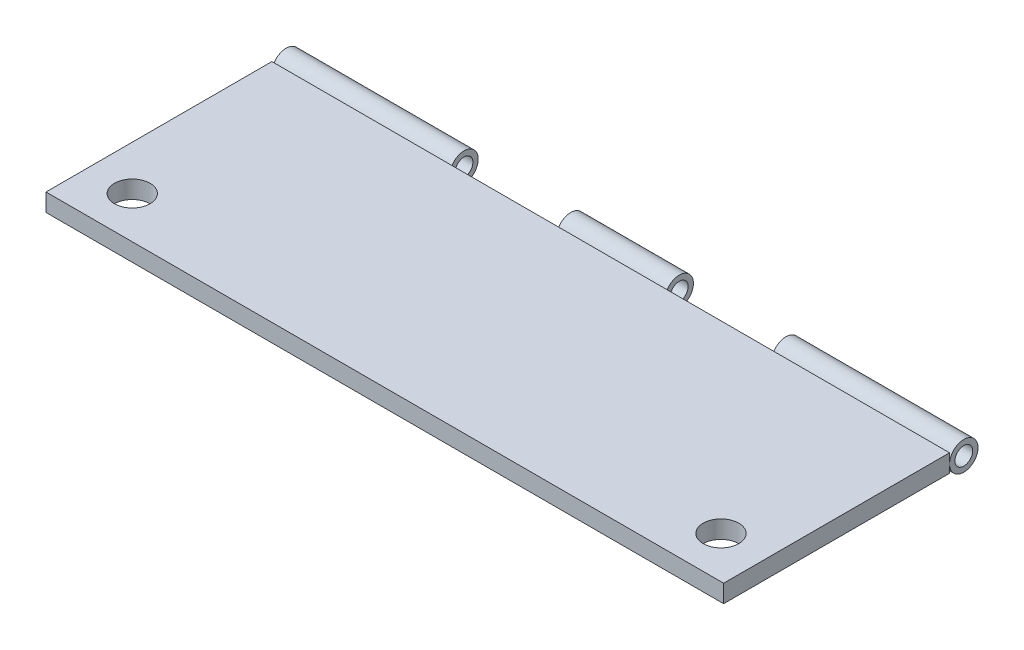
ISO-10303-21;
HEADER;
FILE_DESCRIPTION(('STEP AP214'),'2;1');
FILE_NAME('part.step','',(''),(''),'','','');
FILE_SCHEMA(('AUTOMOTIVE_DESIGN { 1 0 10303 214 1 1 1 1 }'));
ENDSEC;
DATA;
#1=APPLICATION_CONTEXT('core data for automotive mechanical design processes');
#2=APPLICATION_PROTOCOL_DEFINITION('international standard','automotive_design',2000,#1);
#3=PRODUCT_CONTEXT('',#1,'mechanical');
#4=PRODUCT('Part','Part','',(#3));
#5=PRODUCT_RELATED_PRODUCT_CATEGORY('part','',(#4));
#6=PRODUCT_DEFINITION_FORMATION('','',#4);
#7=PRODUCT_DEFINITION_CONTEXT('part definition',#1,'design');
#8=PRODUCT_DEFINITION('design','',#6,#7);
#9=PRODUCT_DEFINITION_SHAPE('','',#8);
#10=(LENGTH_UNIT() NAMED_UNIT(*) SI_UNIT(.MILLI.,.METRE.));
#11=(NAMED_UNIT(*) PLANE_ANGLE_UNIT() SI_UNIT($,.RADIAN.));
#12=(NAMED_UNIT(*) SI_UNIT($,.STERADIAN.) SOLID_ANGLE_UNIT());
#13=UNCERTAINTY_MEASURE_WITH_UNIT(LENGTH_MEASURE(1.E-05),#10,'distance_accuracy_value','');
#14=(GEOMETRIC_REPRESENTATION_CONTEXT(3) GLOBAL_UNCERTAINTY_ASSIGNED_CONTEXT((#13)) GLOBAL_UNIT_ASSIGNED_CONTEXT((#10,
#11,#12)) REPRESENTATION_CONTEXT('',''));
#15=CARTESIAN_POINT('',(0.,0.,0.));
#16=DIRECTION('',(0.,0.,1.));
#17=DIRECTION('',(1.,0.,0.));
#18=AXIS2_PLACEMENT_3D('',#15,#16,#17);
#19=CARTESIAN_POINT('',(42.6254833995939,0.901009784155106,-14.3061802949504));
#20=DIRECTION('',(-1.,0.,0.));
#21=DIRECTION('',(0.,0.,1.));
#22=AXIS2_PLACEMENT_3D('',#19,#20,#21);
#23=CYLINDRICAL_SURFACE('',#22,1.6);
#24=CARTESIAN_POINT('',(-6.09999999999996,0.901009784155106,-14.3061802949504));
#25=DIRECTION('',(1.,0.,0.));
#26=DIRECTION('',(0.,0.,-1.));
#27=AXIS2_PLACEMENT_3D('',#24,#25,#26);
#28=CIRCLE('',#27,1.6);
#29=CARTESIAN_POINT('',(-6.09999999999996,0.901009784155106,-15.9061802949504));
#30=VERTEX_POINT('',#29);
#31=EDGE_CURVE('E47',#30,#30,#28,.F.);
#32=ORIENTED_EDGE('',*,*,#31,.F.);
#33=EDGE_LOOP('',(#32));
#34=FACE_BOUND('',#33,.T.);
#35=CARTESIAN_POINT('',(6.10000000000004,0.901009784155106,-14.3061802949504));
#36=DIRECTION('',(1.,0.,0.));
#37=DIRECTION('',(0.,0.,-1.));
#38=AXIS2_PLACEMENT_3D('',#35,#36,#37);
#39=CIRCLE('',#38,1.6);
#40=CARTESIAN_POINT('',(6.10000000000004,0.901009784155106,-15.9061802949504));
#41=VERTEX_POINT('',#40);
#42=EDGE_CURVE('E43',#41,#41,#39,.F.);
#43=ORIENTED_EDGE('',*,*,#42,.T.);
#44=EDGE_LOOP('',(#43));
#45=FACE_BOUND('',#44,.T.);
#46=ADVANCED_FACE('F39',(#34,#45),#23,.T.);
#47=CARTESIAN_POINT('',(40.9284271247462,0.901009784155106,-14.3061802949504));
#48=DIRECTION('',(-1.,0.,0.));
#49=DIRECTION('',(0.,0.,1.));
#50=AXIS2_PLACEMENT_3D('',#47,#48,#49);
#51=CYLINDRICAL_SURFACE('',#50,1.);
#52=CARTESIAN_POINT('',(-6.09999999999996,0.901009784155106,-14.3061802949504));
#53=DIRECTION('',(1.,0.,0.));
#54=DIRECTION('',(0.,0.,-1.));
#55=AXIS2_PLACEMENT_3D('',#52,#53,#54);
#56=CIRCLE('',#55,1.);
#57=CARTESIAN_POINT('',(-6.09999999999996,0.901009784155106,-13.3061802949504));
#58=VERTEX_POINT('',#57);
#59=EDGE_CURVE('E52',#58,#58,#56,.F.);
#60=CARTESIAN_POINT('',(6.10000000000004,0.901009784155106,-14.3061802949504));
#61=DIRECTION('',(1.,0.,0.));
#62=DIRECTION('',(0.,0.,-1.));
#63=AXIS2_PLACEMENT_3D('',#60,#61,#62);
#64=CIRCLE('',#63,1.);
#65=CARTESIAN_POINT('',(6.10000000000003,0.901009784155106,-13.3061802949504));
#66=VERTEX_POINT('',#65);
#67=EDGE_CURVE('E11',#66,#66,#64,.F.);
#68=CARTESIAN_POINT('',(-6.09999999999996,0.901009784155106,-13.3061802949504));
#69=CARTESIAN_POINT('',(-5.97291666666663,0.901009784155106,-13.3061802949504));
#70=CARTESIAN_POINT('',(-5.84583333333329,0.901009784155106,-13.3061802949504));
#71=CARTESIAN_POINT('',(-5.59166666666663,0.901009784155106,-13.3061802949504));
#72=CARTESIAN_POINT('',(-5.46458333333329,0.901009784155106,-13.3061802949504));
#73=CARTESIAN_POINT('',(-5.21041666666663,0.901009784155106,-13.3061802949504));
#74=CARTESIAN_POINT('',(-5.08333333333329,0.901009784155106,-13.3061802949504));
#75=CARTESIAN_POINT('',(-4.82916666666663,0.901009784155106,-13.3061802949504));
#76=CARTESIAN_POINT('',(-4.70208333333329,0.901009784155106,-13.3061802949504));
#77=CARTESIAN_POINT('',(-4.44791666666663,0.901009784155106,-13.3061802949504));
#78=CARTESIAN_POINT('',(-4.32083333333329,0.901009784155106,-13.3061802949504));
#79=CARTESIAN_POINT('',(-4.06666666666663,0.901009784155106,-13.3061802949504));
#80=CARTESIAN_POINT('',(-3.9395833333333,0.901009784155106,-13.3061802949504));
#81=CARTESIAN_POINT('',(-3.68541666666663,0.901009784155106,-13.3061802949504));
#82=CARTESIAN_POINT('',(-3.5583333333333,0.901009784155106,-13.3061802949504));
#83=CARTESIAN_POINT('',(-3.30416666666663,0.901009784155106,-13.3061802949504));
#84=CARTESIAN_POINT('',(-3.1770833333333,0.901009784155106,-13.3061802949504));
#85=CARTESIAN_POINT('',(-2.92291666666663,0.901009784155106,-13.3061802949504));
#86=CARTESIAN_POINT('',(-2.7958333333333,0.901009784155106,-13.3061802949504));
#87=CARTESIAN_POINT('',(-2.54166666666663,0.901009784155106,-13.3061802949504));
#88=CARTESIAN_POINT('',(-2.4145833333333,0.901009784155106,-13.3061802949504));
#89=CARTESIAN_POINT('',(-2.16041666666663,0.901009784155106,-13.3061802949504));
#90=CARTESIAN_POINT('',(-2.0333333333333,0.901009784155106,-13.3061802949504));
#91=CARTESIAN_POINT('',(-1.77916666666663,0.901009784155106,-13.3061802949504));
#92=CARTESIAN_POINT('',(-1.6520833333333,0.901009784155106,-13.3061802949504));
#93=CARTESIAN_POINT('',(-1.39791666666663,0.901009784155106,-13.3061802949504));
#94=CARTESIAN_POINT('',(-1.2708333333333,0.901009784155106,-13.3061802949504));
#95=CARTESIAN_POINT('',(-1.01666666666663,0.901009784155106,-13.3061802949504));
#96=CARTESIAN_POINT('',(-0.889583333333298,0.901009784155106,-13.3061802949504));
#97=CARTESIAN_POINT('',(-0.635416666666631,0.901009784155106,-13.3061802949504));
#98=CARTESIAN_POINT('',(-0.508333333333298,0.901009784155106,-13.3061802949504));
#99=CARTESIAN_POINT('',(-0.254166666666632,0.901009784155106,-13.3061802949504));
#100=CARTESIAN_POINT('',(-0.127083333333299,0.901009784155106,-13.3061802949504));
#101=CARTESIAN_POINT('',(0.127083333333368,0.901009784155106,-13.3061802949504));
#102=CARTESIAN_POINT('',(0.254166666666701,0.901009784155106,-13.3061802949504));
#103=CARTESIAN_POINT('',(0.508333333333367,0.901009784155106,-13.3061802949504));
#104=CARTESIAN_POINT('',(0.635416666666701,0.901009784155106,-13.3061802949504));
#105=CARTESIAN_POINT('',(0.889583333333367,0.901009784155106,-13.3061802949504));
#106=CARTESIAN_POINT('',(1.0166666666667,0.901009784155106,-13.3061802949504));
#107=CARTESIAN_POINT('',(1.27083333333337,0.901009784155106,-13.3061802949504));
#108=CARTESIAN_POINT('',(1.3979166666667,0.901009784155106,-13.3061802949504));
#109=CARTESIAN_POINT('',(1.65208333333337,0.901009784155106,-13.3061802949504));
#110=CARTESIAN_POINT('',(1.7791666666667,0.901009784155106,-13.3061802949504));
#111=CARTESIAN_POINT('',(2.03333333333337,0.901009784155106,-13.3061802949504));
#112=CARTESIAN_POINT('',(2.1604166666667,0.901009784155106,-13.3061802949504));
#113=CARTESIAN_POINT('',(2.41458333333337,0.901009784155106,-13.3061802949504));
#114=CARTESIAN_POINT('',(2.5416666666667,0.901009784155106,-13.3061802949504));
#115=CARTESIAN_POINT('',(2.79583333333337,0.901009784155106,-13.3061802949504));
#116=CARTESIAN_POINT('',(2.9229166666667,0.901009784155106,-13.3061802949504));
#117=CARTESIAN_POINT('',(3.17708333333337,0.901009784155106,-13.3061802949504));
#118=CARTESIAN_POINT('',(3.3041666666667,0.901009784155106,-13.3061802949504));
#119=CARTESIAN_POINT('',(3.55833333333336,0.901009784155106,-13.3061802949504));
#120=CARTESIAN_POINT('',(3.6854166666667,0.901009784155106,-13.3061802949504));
#121=CARTESIAN_POINT('',(3.93958333333336,0.901009784155106,-13.3061802949504));
#122=CARTESIAN_POINT('',(4.0666666666667,0.901009784155106,-13.3061802949504));
#123=CARTESIAN_POINT('',(4.32083333333336,0.901009784155106,-13.3061802949504));
#124=CARTESIAN_POINT('',(4.4479166666667,0.901009784155106,-13.3061802949504));
#125=CARTESIAN_POINT('',(4.70208333333336,0.901009784155106,-13.3061802949504));
#126=CARTESIAN_POINT('',(4.8291666666667,0.901009784155106,-13.3061802949504));
#127=CARTESIAN_POINT('',(5.08333333333336,0.901009784155106,-13.3061802949504));
#128=CARTESIAN_POINT('',(5.2104166666667,0.901009784155106,-13.3061802949504));
#129=CARTESIAN_POINT('',(5.46458333333336,0.901009784155106,-13.3061802949504));
#130=CARTESIAN_POINT('',(5.5916666666667,0.901009784155106,-13.3061802949504));
#131=CARTESIAN_POINT('',(5.84583333333336,0.901009784155106,-13.3061802949504));
#132=CARTESIAN_POINT('',(5.9729166666667,0.901009784155106,-13.3061802949504));
#133=CARTESIAN_POINT('',(6.10000000000003,0.901009784155106,-13.3061802949504));
#134=B_SPLINE_CURVE_WITH_KNOTS('',3,(#68,#69,#70,#71,#72,#73,#74,#75,#76,#77,#78,#79,#80,#81,
#82,#83,#84,#85,#86,#87,#88,#89,#90,#91,#92,#93,#94,#95,#96,#97,#98,#99,#100,#101,#102,#103,
#104,#105,#106,#107,#108,#109,#110,#111,#112,#113,#114,#115,#116,#117,#118,#119,#120,#121,#122,
#123,#124,#125,#126,#127,#128,#129,#130,#131,#132,#133),.UNSPECIFIED.,.F.,.F.,(4,2,2,2,2,2,2,2,
2,2,2,2,2,2,2,2,2,2,2,2,2,2,2,2,2,2,2,2,2,2,2,2,4),(0.,0.38125,0.762499999999999,1.14375,1.525,
1.90625,2.2875,2.66875,3.05,3.43125,3.8125,4.19375,4.575,4.95625,5.3375,5.71874999999999,
6.09999999999999,6.48124999999999,6.86249999999999,7.24374999999999,7.62499999999999,
8.00624999999999,8.38749999999999,8.76874999999999,9.14999999999999,9.53124999999999,
9.91249999999999,10.29375,10.675,11.05625,11.4375,11.81875,12.2),.UNSPECIFIED.);
#135=EDGE_CURVE('BSEAM41',#58,#66,#134,.T.);
#136=ORIENTED_EDGE('',*,*,#59,.T.);
#137=ORIENTED_EDGE('',*,*,#67,.F.);
#138=ORIENTED_EDGE('',*,*,#135,.T.);
#139=ORIENTED_EDGE('',*,*,#135,.F.);
#140=EDGE_LOOP('',(#136,#138,#137,#139));
#141=FACE_BOUND('',#140,.T.);
#142=ADVANCED_FACE('F41',(#141),#51,.F.);
#143=CARTESIAN_POINT('',(-6.09999999999996,-0.699990215844896,-12.7061802949504));
#144=DIRECTION('',(1.,0.,0.));
#145=DIRECTION('',(0.,0.,-1.));
#146=AXIS2_PLACEMENT_3D('',#143,#144,#145);
#147=PLANE('',#146);
#148=ORIENTED_EDGE('',*,*,#31,.T.);
#149=EDGE_LOOP('',(#148));
#150=FACE_BOUND('',#149,.T.);
#151=ORIENTED_EDGE('',*,*,#59,.F.);
#152=EDGE_LOOP('',(#151));
#153=FACE_BOUND('',#152,.T.);
#154=ADVANCED_FACE('F63',(#150,#153),#147,.F.);
#155=CARTESIAN_POINT('',(6.10000000000003,-0.699990215844896,0.));
#156=DIRECTION('',(1.,0.,0.));
#157=DIRECTION('',(0.,0.,-1.));
#158=AXIS2_PLACEMENT_3D('',#155,#156,#157);
#159=PLANE('',#158);
#160=ORIENTED_EDGE('',*,*,#42,.F.);
#161=EDGE_LOOP('',(#160));
#162=FACE_BOUND('',#161,.T.);
#163=ORIENTED_EDGE('',*,*,#67,.T.);
#164=EDGE_LOOP('',(#163));
#165=FACE_BOUND('',#164,.T.);
#166=ADVANCED_FACE('F61',(#162,#165),#159,.T.);
#167=CLOSED_SHELL('',(#46,#142,#154,#166));
#168=MANIFOLD_SOLID_BREP('B2',#167);
#169=CARTESIAN_POINT('',(42.6254833995939,0.901009784155106,-14.3061802949504));
#170=DIRECTION('',(-1.,0.,0.));
#171=DIRECTION('',(0.,0.,1.));
#172=AXIS2_PLACEMENT_3D('',#169,#170,#171);
#173=CYLINDRICAL_SURFACE('',#172,1.6);
#174=CARTESIAN_POINT('',(-38.1,0.901009784155106,-14.3061802949504));
#175=DIRECTION('',(-1.,0.,0.));
#176=DIRECTION('',(0.,0.,1.));
#177=AXIS2_PLACEMENT_3D('',#174,#175,#176);
#178=CIRCLE('',#177,1.6);
#179=CARTESIAN_POINT('',(-38.1,0.901009784155106,-12.7061802949504));
#180=VERTEX_POINT('',#179);
#181=EDGE_CURVE('E128',#180,#180,#178,.T.);
#182=ORIENTED_EDGE('',*,*,#181,.F.);
#183=EDGE_LOOP('',(#182));
#184=FACE_BOUND('',#183,.T.);
#185=CARTESIAN_POINT('',(-18.1,0.901009784155106,-14.3061802949504));
#186=DIRECTION('',(1.,0.,0.));
#187=DIRECTION('',(0.,0.,-1.));
#188=AXIS2_PLACEMENT_3D('',#185,#186,#187);
#189=CIRCLE('',#188,1.6);
#190=CARTESIAN_POINT('',(-18.1,0.901009784155106,-15.9061802949504));
#191=VERTEX_POINT('',#190);
#192=EDGE_CURVE('E124',#191,#191,#189,.F.);
#193=ORIENTED_EDGE('',*,*,#192,.T.);
#194=EDGE_LOOP('',(#193));
#195=FACE_BOUND('',#194,.T.);
#196=ADVANCED_FACE('F120',(#184,#195),#173,.T.);
#197=CARTESIAN_POINT('',(40.9284271247462,0.901009784155106,-14.3061802949504));
#198=DIRECTION('',(-1.,0.,0.));
#199=DIRECTION('',(0.,0.,1.));
#200=AXIS2_PLACEMENT_3D('',#197,#198,#199);
#201=CYLINDRICAL_SURFACE('',#200,1.);
#202=CARTESIAN_POINT('',(-38.1,0.901009784155106,-14.3061802949504));
#203=DIRECTION('',(-1.,0.,0.));
#204=DIRECTION('',(0.,0.,1.));
#205=AXIS2_PLACEMENT_3D('',#202,#203,#204);
#206=CIRCLE('',#205,1.);
#207=CARTESIAN_POINT('',(-38.1,0.901009784155106,-13.3061802949504));
#208=VERTEX_POINT('',#207);
#209=EDGE_CURVE('E133',#208,#208,#206,.T.);
#210=CARTESIAN_POINT('',(-18.1,0.901009784155106,-14.3061802949504));
#211=DIRECTION('',(1.,0.,0.));
#212=DIRECTION('',(0.,0.,-1.));
#213=AXIS2_PLACEMENT_3D('',#210,#211,#212);
#214=CIRCLE('',#213,1.);
#215=CARTESIAN_POINT('',(-18.1,0.901009784155106,-13.3061802949504));
#216=VERTEX_POINT('',#215);
#217=EDGE_CURVE('E38',#216,#216,#214,.F.);
#218=CARTESIAN_POINT('',(-38.1,0.901009784155106,-13.3061802949504));
#219=CARTESIAN_POINT('',(-37.8916666666666,0.901009784155106,-13.3061802949504));
#220=CARTESIAN_POINT('',(-37.6833333333333,0.901009784155106,-13.3061802949504));
#221=CARTESIAN_POINT('',(-37.2666666666666,0.901009784155106,-13.3061802949504));
#222=CARTESIAN_POINT('',(-37.0583333333333,0.901009784155106,-13.3061802949504));
#223=CARTESIAN_POINT('',(-36.6416666666666,0.901009784155106,-13.3061802949504));
#224=CARTESIAN_POINT('',(-36.4333333333333,0.901009784155106,-13.3061802949504));
#225=CARTESIAN_POINT('',(-36.0166666666666,0.901009784155106,-13.3061802949504));
#226=CARTESIAN_POINT('',(-35.8083333333333,0.901009784155106,-13.3061802949504));
#227=CARTESIAN_POINT('',(-35.3916666666666,0.901009784155106,-13.3061802949504));
#228=CARTESIAN_POINT('',(-35.1833333333333,0.901009784155106,-13.3061802949504));
#229=CARTESIAN_POINT('',(-34.7666666666666,0.901009784155106,-13.3061802949504));
#230=CARTESIAN_POINT('',(-34.5583333333333,0.901009784155106,-13.3061802949504));
#231=CARTESIAN_POINT('',(-34.1416666666666,0.901009784155106,-13.3061802949504));
#232=CARTESIAN_POINT('',(-33.9333333333333,0.901009784155106,-13.3061802949504));
#233=CARTESIAN_POINT('',(-33.5166666666666,0.901009784155106,-13.3061802949504));
#234=CARTESIAN_POINT('',(-33.3083333333333,0.901009784155106,-13.3061802949504));
#235=CARTESIAN_POINT('',(-32.8916666666666,0.901009784155106,-13.3061802949504));
#236=CARTESIAN_POINT('',(-32.6833333333333,0.901009784155106,-13.3061802949504));
#237=CARTESIAN_POINT('',(-32.2666666666666,0.901009784155106,-13.3061802949504));
#238=CARTESIAN_POINT('',(-32.0583333333333,0.901009784155106,-13.3061802949504));
#239=CARTESIAN_POINT('',(-31.6416666666666,0.901009784155106,-13.3061802949504));
#240=CARTESIAN_POINT('',(-31.4333333333333,0.901009784155106,-13.3061802949504));
#241=CARTESIAN_POINT('',(-31.0166666666666,0.901009784155106,-13.3061802949504));
#242=CARTESIAN_POINT('',(-30.8083333333333,0.901009784155106,-13.3061802949504));
#243=CARTESIAN_POINT('',(-30.3916666666666,0.901009784155106,-13.3061802949504));
#244=CARTESIAN_POINT('',(-30.1833333333333,0.901009784155106,-13.3061802949504));
#245=CARTESIAN_POINT('',(-29.7666666666666,0.901009784155106,-13.3061802949504));
#246=CARTESIAN_POINT('',(-29.5583333333333,0.901009784155106,-13.3061802949504));
#247=CARTESIAN_POINT('',(-29.1416666666666,0.901009784155106,-13.3061802949504));
#248=CARTESIAN_POINT('',(-28.9333333333333,0.901009784155106,-13.3061802949504));
#249=CARTESIAN_POINT('',(-28.5166666666666,0.901009784155106,-13.3061802949504));
#250=CARTESIAN_POINT('',(-28.3083333333333,0.901009784155106,-13.3061802949504));
#251=CARTESIAN_POINT('',(-27.8916666666666,0.901009784155106,-13.3061802949504));
#252=CARTESIAN_POINT('',(-27.6833333333333,0.901009784155106,-13.3061802949504));
#253=CARTESIAN_POINT('',(-27.2666666666666,0.901009784155106,-13.3061802949504));
#254=CARTESIAN_POINT('',(-27.0583333333333,0.901009784155106,-13.3061802949504));
#255=CARTESIAN_POINT('',(-26.6416666666666,0.901009784155106,-13.3061802949504));
#256=CARTESIAN_POINT('',(-26.4333333333333,0.901009784155106,-13.3061802949504));
#257=CARTESIAN_POINT('',(-26.0166666666666,0.901009784155106,-13.3061802949504));
#258=CARTESIAN_POINT('',(-25.8083333333333,0.901009784155106,-13.3061802949504));
#259=CARTESIAN_POINT('',(-25.3916666666666,0.901009784155106,-13.3061802949504));
#260=CARTESIAN_POINT('',(-25.1833333333333,0.901009784155106,-13.3061802949504));
#261=CARTESIAN_POINT('',(-24.7666666666666,0.901009784155106,-13.3061802949504));
#262=CARTESIAN_POINT('',(-24.5583333333333,0.901009784155106,-13.3061802949504));
#263=CARTESIAN_POINT('',(-24.1416666666666,0.901009784155106,-13.3061802949504));
#264=CARTESIAN_POINT('',(-23.9333333333333,0.901009784155106,-13.3061802949504));
#265=CARTESIAN_POINT('',(-23.5166666666666,0.901009784155106,-13.3061802949504));
#266=CARTESIAN_POINT('',(-23.3083333333333,0.901009784155106,-13.3061802949504));
#267=CARTESIAN_POINT('',(-22.8916666666666,0.901009784155106,-13.3061802949504));
#268=CARTESIAN_POINT('',(-22.6833333333333,0.901009784155106,-13.3061802949504));
#269=CARTESIAN_POINT('',(-22.2666666666666,0.901009784155106,-13.3061802949504));
#270=CARTESIAN_POINT('',(-22.0583333333333,0.901009784155106,-13.3061802949504));
#271=CARTESIAN_POINT('',(-21.6416666666666,0.901009784155106,-13.3061802949504));
#272=CARTESIAN_POINT('',(-21.4333333333333,0.901009784155106,-13.3061802949504));
#273=CARTESIAN_POINT('',(-21.0166666666667,0.901009784155106,-13.3061802949504));
#274=CARTESIAN_POINT('',(-20.8083333333333,0.901009784155106,-13.3061802949504));
#275=CARTESIAN_POINT('',(-20.3916666666667,0.901009784155106,-13.3061802949504));
#276=CARTESIAN_POINT('',(-20.1833333333333,0.901009784155106,-13.3061802949504));
#277=CARTESIAN_POINT('',(-19.7666666666667,0.901009784155106,-13.3061802949504));
#278=CARTESIAN_POINT('',(-19.5583333333333,0.901009784155106,-13.3061802949504));
#279=CARTESIAN_POINT('',(-19.1416666666667,0.901009784155106,-13.3061802949504));
#280=CARTESIAN_POINT('',(-18.9333333333333,0.901009784155106,-13.3061802949504));
#281=CARTESIAN_POINT('',(-18.5166666666667,0.901009784155106,-13.3061802949504));
#282=CARTESIAN_POINT('',(-18.3083333333333,0.901009784155106,-13.3061802949504));
#283=CARTESIAN_POINT('',(-18.1,0.901009784155106,-13.3061802949504));
#284=B_SPLINE_CURVE_WITH_KNOTS('',3,(#218,#219,#220,#221,#222,#223,#224,#225,#226,#227,#228,
#229,#230,#231,#232,#233,#234,#235,#236,#237,#238,#239,#240,#241,#242,#243,#244,#245,#246,#247,
#248,#249,#250,#251,#252,#253,#254,#255,#256,#257,#258,#259,#260,#261,#262,#263,#264,#265,#266,
#267,#268,#269,#270,#271,#272,#273,#274,#275,#276,#277,#278,#279,#280,#281,#282,#283),
.UNSPECIFIED.,.F.,.F.,(4,2,2,2,2,2,2,2,2,2,2,2,2,2,2,2,2,2,2,2,2,2,2,2,2,2,2,2,2,2,2,2,4),(0.,
0.625000000000001,1.25,1.875,2.5,3.125,3.75,4.375,5.,5.62499999999999,6.24999999999999,
6.87499999999999,7.49999999999999,8.12499999999999,8.74999999999999,9.37499999999999,
9.99999999999999,10.625,11.25,11.875,12.5,13.125,13.75,14.375,15.,15.625,16.25,16.875,17.5,
18.125,18.75,19.375,20.),.UNSPECIFIED.);
#285=EDGE_CURVE('BSEAM122',#208,#216,#284,.T.);
#286=ORIENTED_EDGE('',*,*,#209,.T.);
#287=ORIENTED_EDGE('',*,*,#217,.F.);
#288=ORIENTED_EDGE('',*,*,#285,.T.);
#289=ORIENTED_EDGE('',*,*,#285,.F.);
#290=EDGE_LOOP('',(#286,#288,#287,#289));
#291=FACE_BOUND('',#290,.T.);
#292=ADVANCED_FACE('F122',(#291),#201,.F.);
#293=CARTESIAN_POINT('',(-38.1,0.901009784155106,-14.3061802949504));
#294=DIRECTION('',(-1.,0.,0.));
#295=DIRECTION('',(0.,0.,1.));
#296=AXIS2_PLACEMENT_3D('',#293,#294,#295);
#297=PLANE('',#296);
#298=ORIENTED_EDGE('',*,*,#209,.F.);
#299=EDGE_LOOP('',(#298));
#300=FACE_BOUND('',#299,.T.);
#301=ORIENTED_EDGE('',*,*,#181,.T.);
#302=EDGE_LOOP('',(#301));
#303=FACE_BOUND('',#302,.T.);
#304=ADVANCED_FACE('F144',(#300,#303),#297,.T.);
#305=CARTESIAN_POINT('',(-18.1,-0.699990215844896,-12.7061802949504));
#306=DIRECTION('',(1.,0.,0.));
#307=DIRECTION('',(0.,0.,-1.));
#308=AXIS2_PLACEMENT_3D('',#305,#306,#307);
#309=PLANE('',#308);
#310=ORIENTED_EDGE('',*,*,#192,.F.);
#311=EDGE_LOOP('',(#310));
#312=FACE_BOUND('',#311,.T.);
#313=ORIENTED_EDGE('',*,*,#217,.T.);
#314=EDGE_LOOP('',(#313));
#315=FACE_BOUND('',#314,.T.);
#316=ADVANCED_FACE('F142',(#312,#315),#309,.T.);
#317=CLOSED_SHELL('',(#196,#292,#304,#316));
#318=MANIFOLD_SOLID_BREP('B6',#317);
#319=CARTESIAN_POINT('',(42.6254833995939,0.901009784155106,-14.3061802949504));
#320=DIRECTION('',(-1.,0.,0.));
#321=DIRECTION('',(0.,0.,1.));
#322=AXIS2_PLACEMENT_3D('',#319,#320,#321);
#323=CYLINDRICAL_SURFACE('',#322,1.6);
#324=CARTESIAN_POINT('',(18.1,0.901009784155106,-14.3061802949504));
#325=DIRECTION('',(1.,0.,0.));
#326=DIRECTION('',(0.,0.,-1.));
#327=AXIS2_PLACEMENT_3D('',#324,#325,#326);
#328=CIRCLE('',#327,1.6);
#329=CARTESIAN_POINT('',(18.1,0.901009784155106,-15.9061802949504));
#330=VERTEX_POINT('',#329);
#331=EDGE_CURVE('E207',#330,#330,#328,.F.);
#332=ORIENTED_EDGE('',*,*,#331,.F.);
#333=EDGE_LOOP('',(#332));
#334=FACE_BOUND('',#333,.T.);
#335=CARTESIAN_POINT('',(38.1,0.901009784155106,-14.3061802949504));
#336=DIRECTION('',(-1.,0.,0.));
#337=DIRECTION('',(0.,0.,1.));
#338=AXIS2_PLACEMENT_3D('',#335,#336,#337);
#339=CIRCLE('',#338,1.6);
#340=CARTESIAN_POINT('',(38.1,0.901009784155106,-12.7061802949504));
#341=VERTEX_POINT('',#340);
#342=EDGE_CURVE('E119',#341,#341,#339,.F.);
#343=ORIENTED_EDGE('',*,*,#342,.F.);
#344=EDGE_LOOP('',(#343));
#345=FACE_BOUND('',#344,.T.);
#346=ADVANCED_FACE('F196',(#334,#345),#323,.T.);
#347=CARTESIAN_POINT('',(38.1,2.,12.7));
#348=DIRECTION('',(-1.,0.,0.));
#349=DIRECTION('',(0.,0.,1.));
#350=AXIS2_PLACEMENT_3D('',#347,#348,#349);
#351=PLANE('',#350);
#352=CARTESIAN_POINT('',(38.1,0.901009784155106,-14.3061802949504));
#353=DIRECTION('',(-1.,0.,0.));
#354=DIRECTION('',(0.,0.,1.));
#355=AXIS2_PLACEMENT_3D('',#352,#353,#354);
#356=CIRCLE('',#355,1.);
#357=CARTESIAN_POINT('',(38.1,0.901009784155106,-13.3061802949504));
#358=VERTEX_POINT('',#357);
#359=EDGE_CURVE('E203',#358,#358,#356,.F.);
#360=ORIENTED_EDGE('',*,*,#359,.F.);
#361=EDGE_LOOP('',(#360));
#362=FACE_BOUND('',#361,.T.);
#363=ORIENTED_EDGE('',*,*,#342,.T.);
#364=EDGE_LOOP('',(#363));
#365=FACE_BOUND('',#364,.T.);
#366=ADVANCED_FACE('F225',(#362,#365),#351,.F.);
#367=CARTESIAN_POINT('',(40.9284271247462,0.901009784155106,-14.3061802949504));
#368=DIRECTION('',(-1.,0.,0.));
#369=DIRECTION('',(0.,0.,1.));
#370=AXIS2_PLACEMENT_3D('',#367,#368,#369);
#371=CYLINDRICAL_SURFACE('',#370,1.);
#372=CARTESIAN_POINT('',(18.1,0.901009784155106,-14.3061802949504));
#373=DIRECTION('',(1.,0.,0.));
#374=DIRECTION('',(0.,0.,-1.));
#375=AXIS2_PLACEMENT_3D('',#372,#373,#374);
#376=CIRCLE('',#375,1.);
#377=CARTESIAN_POINT('',(18.1,0.901009784155106,-13.3061802949504));
#378=VERTEX_POINT('',#377);
#379=EDGE_CURVE('E199',#378,#378,#376,.F.);
#380=CARTESIAN_POINT('',(18.1,0.901009784155106,-13.3061802949504));
#381=CARTESIAN_POINT('',(18.3083333333334,0.901009784155106,-13.3061802949504));
#382=CARTESIAN_POINT('',(18.5166666666667,0.901009784155106,-13.3061802949504));
#383=CARTESIAN_POINT('',(18.9333333333334,0.901009784155106,-13.3061802949504));
#384=CARTESIAN_POINT('',(19.1416666666667,0.901009784155106,-13.3061802949504));
#385=CARTESIAN_POINT('',(19.5583333333334,0.901009784155106,-13.3061802949504));
#386=CARTESIAN_POINT('',(19.7666666666667,0.901009784155106,-13.3061802949504));
#387=CARTESIAN_POINT('',(20.1833333333334,0.901009784155106,-13.3061802949504));
#388=CARTESIAN_POINT('',(20.3916666666667,0.901009784155106,-13.3061802949504));
#389=CARTESIAN_POINT('',(20.8083333333334,0.901009784155106,-13.3061802949504));
#390=CARTESIAN_POINT('',(21.0166666666667,0.901009784155106,-13.3061802949504));
#391=CARTESIAN_POINT('',(21.4333333333334,0.901009784155106,-13.3061802949504));
#392=CARTESIAN_POINT('',(21.6416666666667,0.901009784155106,-13.3061802949504));
#393=CARTESIAN_POINT('',(22.0583333333334,0.901009784155106,-13.3061802949504));
#394=CARTESIAN_POINT('',(22.2666666666667,0.901009784155106,-13.3061802949504));
#395=CARTESIAN_POINT('',(22.6833333333334,0.901009784155106,-13.3061802949504));
#396=CARTESIAN_POINT('',(22.8916666666667,0.901009784155106,-13.3061802949504));
#397=CARTESIAN_POINT('',(23.3083333333334,0.901009784155106,-13.3061802949504));
#398=CARTESIAN_POINT('',(23.5166666666667,0.901009784155106,-13.3061802949504));
#399=CARTESIAN_POINT('',(23.9333333333334,0.901009784155106,-13.3061802949504));
#400=CARTESIAN_POINT('',(24.1416666666667,0.901009784155106,-13.3061802949504));
#401=CARTESIAN_POINT('',(24.5583333333334,0.901009784155106,-13.3061802949504));
#402=CARTESIAN_POINT('',(24.7666666666667,0.901009784155106,-13.3061802949504));
#403=CARTESIAN_POINT('',(25.1833333333334,0.901009784155106,-13.3061802949504));
#404=CARTESIAN_POINT('',(25.3916666666667,0.901009784155106,-13.3061802949504));
#405=CARTESIAN_POINT('',(25.8083333333334,0.901009784155106,-13.3061802949504));
#406=CARTESIAN_POINT('',(26.0166666666667,0.901009784155106,-13.3061802949504));
#407=CARTESIAN_POINT('',(26.4333333333334,0.901009784155106,-13.3061802949504));
#408=CARTESIAN_POINT('',(26.6416666666667,0.901009784155106,-13.3061802949504));
#409=CARTESIAN_POINT('',(27.0583333333334,0.901009784155106,-13.3061802949504));
#410=CARTESIAN_POINT('',(27.2666666666667,0.901009784155106,-13.3061802949504));
#411=CARTESIAN_POINT('',(27.6833333333334,0.901009784155106,-13.3061802949504));
#412=CARTESIAN_POINT('',(27.8916666666667,0.901009784155106,-13.3061802949504));
#413=CARTESIAN_POINT('',(28.3083333333334,0.901009784155106,-13.3061802949504));
#414=CARTESIAN_POINT('',(28.5166666666667,0.901009784155106,-13.3061802949504));
#415=CARTESIAN_POINT('',(28.9333333333334,0.901009784155106,-13.3061802949504));
#416=CARTESIAN_POINT('',(29.1416666666667,0.901009784155106,-13.3061802949504));
#417=CARTESIAN_POINT('',(29.5583333333334,0.901009784155106,-13.3061802949504));
#418=CARTESIAN_POINT('',(29.7666666666667,0.901009784155106,-13.3061802949504));
#419=CARTESIAN_POINT('',(30.1833333333334,0.901009784155106,-13.3061802949504));
#420=CARTESIAN_POINT('',(30.3916666666667,0.901009784155106,-13.3061802949504));
#421=CARTESIAN_POINT('',(30.8083333333334,0.901009784155106,-13.3061802949504));
#422=CARTESIAN_POINT('',(31.0166666666667,0.901009784155106,-13.3061802949504));
#423=CARTESIAN_POINT('',(31.4333333333334,0.901009784155106,-13.3061802949504));
#424=CARTESIAN_POINT('',(31.6416666666667,0.901009784155106,-13.3061802949504));
#425=CARTESIAN_POINT('',(32.0583333333334,0.901009784155106,-13.3061802949504));
#426=CARTESIAN_POINT('',(32.2666666666667,0.901009784155106,-13.3061802949504));
#427=CARTESIAN_POINT('',(32.6833333333334,0.901009784155106,-13.3061802949504));
#428=CARTESIAN_POINT('',(32.8916666666667,0.901009784155106,-13.3061802949504));
#429=CARTESIAN_POINT('',(33.3083333333334,0.901009784155106,-13.3061802949504));
#430=CARTESIAN_POINT('',(33.5166666666667,0.901009784155106,-13.3061802949504));
#431=CARTESIAN_POINT('',(33.9333333333334,0.901009784155106,-13.3061802949504));
#432=CARTESIAN_POINT('',(34.1416666666667,0.901009784155106,-13.3061802949504));
#433=CARTESIAN_POINT('',(34.5583333333334,0.901009784155106,-13.3061802949504));
#434=CARTESIAN_POINT('',(34.7666666666667,0.901009784155106,-13.3061802949504));
#435=CARTESIAN_POINT('',(35.1833333333334,0.901009784155106,-13.3061802949504));
#436=CARTESIAN_POINT('',(35.3916666666667,0.901009784155106,-13.3061802949504));
#437=CARTESIAN_POINT('',(35.8083333333334,0.901009784155106,-13.3061802949504));
#438=CARTESIAN_POINT('',(36.0166666666667,0.901009784155106,-13.3061802949504));
#439=CARTESIAN_POINT('',(36.4333333333334,0.901009784155106,-13.3061802949504));
#440=CARTESIAN_POINT('',(36.6416666666667,0.901009784155106,-13.3061802949504));
#441=CARTESIAN_POINT('',(37.0583333333334,0.901009784155106,-13.3061802949504));
#442=CARTESIAN_POINT('',(37.2666666666667,0.901009784155106,-13.3061802949504));
#443=CARTESIAN_POINT('',(37.6833333333334,0.901009784155106,-13.3061802949504));
#444=CARTESIAN_POINT('',(37.8916666666667,0.901009784155106,-13.3061802949504));
#445=CARTESIAN_POINT('',(38.1,0.901009784155106,-13.3061802949504));
#446=B_SPLINE_CURVE_WITH_KNOTS('',3,(#380,#381,#382,#383,#384,#385,#386,#387,#388,#389,#390,
#391,#392,#393,#394,#395,#396,#397,#398,#399,#400,#401,#402,#403,#404,#405,#406,#407,#408,#409,
#410,#411,#412,#413,#414,#415,#416,#417,#418,#419,#420,#421,#422,#423,#424,#425,#426,#427,#428,
#429,#430,#431,#432,#433,#434,#435,#436,#437,#438,#439,#440,#441,#442,#443,#444,#445),
.UNSPECIFIED.,.F.,.F.,(4,2,2,2,2,2,2,2,2,2,2,2,2,2,2,2,2,2,2,2,2,2,2,2,2,2,2,2,2,2,2,2,4),(0.,
0.625000000000001,1.25,1.875,2.5,3.125,3.75,4.375,5.,5.625,6.25,6.875,7.5,8.125,8.75,9.375,10.,
10.625,11.25,11.875,12.5,13.125,13.75,14.375,15.,15.625,16.25,16.875,17.5,18.125,18.75,19.375,
20.),.UNSPECIFIED.);
#447=EDGE_CURVE('BSEAM216',#378,#358,#446,.T.);
#448=ORIENTED_EDGE('',*,*,#379,.T.);
#449=ORIENTED_EDGE('',*,*,#359,.T.);
#450=ORIENTED_EDGE('',*,*,#447,.T.);
#451=ORIENTED_EDGE('',*,*,#447,.F.);
#452=EDGE_LOOP('',(#448,#450,#449,#451));
#453=FACE_BOUND('',#452,.T.);
#454=ADVANCED_FACE('F216',(#453),#371,.F.);
#455=CARTESIAN_POINT('',(18.1,-0.699990215844896,0.));
#456=DIRECTION('',(1.,0.,0.));
#457=DIRECTION('',(0.,0.,-1.));
#458=AXIS2_PLACEMENT_3D('',#455,#456,#457);
#459=PLANE('',#458);
#460=ORIENTED_EDGE('',*,*,#331,.T.);
#461=EDGE_LOOP('',(#460));
#462=FACE_BOUND('',#461,.T.);
#463=ORIENTED_EDGE('',*,*,#379,.F.);
#464=EDGE_LOOP('',(#463));
#465=FACE_BOUND('',#464,.T.);
#466=ADVANCED_FACE('F219',(#462,#465),#459,.F.);
#467=CLOSED_SHELL('',(#346,#366,#454,#466));
#468=MANIFOLD_SOLID_BREP('B33',#467);
#469=CARTESIAN_POINT('',(38.1,2.,12.7));
#470=DIRECTION('',(-1.,0.,0.));
#471=DIRECTION('',(0.,0.,1.));
#472=AXIS2_PLACEMENT_3D('',#469,#470,#471);
#473=PLANE('',#472);
#474=DIRECTION('',(0.,0.,-1.));
#475=VECTOR('',#474,1.);
#476=CARTESIAN_POINT('',(38.1,0.,12.7));
#477=LINE('',#476,#475);
#478=CARTESIAN_POINT('',(38.1,0.,12.7));
#479=VERTEX_POINT('',#478);
#480=CARTESIAN_POINT('',(38.1,0.,-12.7));
#481=VERTEX_POINT('',#480);
#482=EDGE_CURVE('E326',#479,#481,#477,.T.);
#483=ORIENTED_EDGE('',*,*,#482,.T.);
#484=DIRECTION('',(0.,-1.,0.));
#485=VECTOR('',#484,1.);
#486=CARTESIAN_POINT('',(38.1,2.,-12.7));
#487=LINE('',#486,#485);
#488=CARTESIAN_POINT('',(38.1,2.,-12.7));
#489=VERTEX_POINT('',#488);
#490=EDGE_CURVE('E194',#489,#481,#487,.T.);
#491=ORIENTED_EDGE('',*,*,#490,.F.);
#492=DIRECTION('',(0.,0.,-1.));
#493=VECTOR('',#492,1.);
#494=CARTESIAN_POINT('',(38.1,2.,12.7));
#495=LINE('',#494,#493);
#496=CARTESIAN_POINT('',(38.1,2.,12.7));
#497=VERTEX_POINT('',#496);
#498=EDGE_CURVE('E314',#497,#489,#495,.T.);
#499=ORIENTED_EDGE('',*,*,#498,.F.);
#500=DIRECTION('',(0.,-1.,0.));
#501=VECTOR('',#500,1.);
#502=CARTESIAN_POINT('',(38.1,2.,12.7));
#503=LINE('',#502,#501);
#504=EDGE_CURVE('E322',#497,#479,#503,.T.);
#505=ORIENTED_EDGE('',*,*,#504,.T.);
#506=EDGE_LOOP('',(#483,#491,#499,#505));
#507=FACE_BOUND('',#506,.T.);
#508=ADVANCED_FACE('F263',(#507),#473,.F.);
#509=CARTESIAN_POINT('',(-38.1,2.,-12.7));
#510=DIRECTION('',(0.,0.,1.));
#511=DIRECTION('',(1.,0.,0.));
#512=AXIS2_PLACEMENT_3D('',#509,#510,#511);
#513=PLANE('',#512);
#514=DIRECTION('',(-1.,0.,0.));
#515=VECTOR('',#514,1.);
#516=CARTESIAN_POINT('',(-38.1,0.,-12.7));
#517=LINE('',#516,#515);
#518=CARTESIAN_POINT('',(-38.1,0.,-12.7));
#519=VERTEX_POINT('',#518);
#520=EDGE_CURVE('E318',#481,#519,#517,.T.);
#521=ORIENTED_EDGE('',*,*,#520,.T.);
#522=DIRECTION('',(0.,-1.,0.));
#523=VECTOR('',#522,1.);
#524=CARTESIAN_POINT('',(-38.1,2.,-12.7));
#525=LINE('',#524,#523);
#526=CARTESIAN_POINT('',(-38.1,2.,-12.7));
#527=VERTEX_POINT('',#526);
#528=EDGE_CURVE('E271',#527,#519,#525,.T.);
#529=ORIENTED_EDGE('',*,*,#528,.F.);
#530=DIRECTION('',(-1.,0.,0.));
#531=VECTOR('',#530,1.);
#532=CARTESIAN_POINT('',(-38.1,2.,-12.7));
#533=LINE('',#532,#531);
#534=EDGE_CURVE('E309',#489,#527,#533,.T.);
#535=ORIENTED_EDGE('',*,*,#534,.F.);
#536=ORIENTED_EDGE('',*,*,#490,.T.);
#537=EDGE_LOOP('',(#521,#529,#535,#536));
#538=FACE_BOUND('',#537,.T.);
#539=ADVANCED_FACE('F317',(#538),#513,.F.);
#540=CARTESIAN_POINT('',(-38.1,2.,12.7));
#541=DIRECTION('',(1.,0.,0.));
#542=DIRECTION('',(0.,0.,-1.));
#543=AXIS2_PLACEMENT_3D('',#540,#541,#542);
#544=PLANE('',#543);
#545=DIRECTION('',(0.,0.,1.));
#546=VECTOR('',#545,1.);
#547=CARTESIAN_POINT('',(-38.1,0.,12.7));
#548=LINE('',#547,#546);
#549=CARTESIAN_POINT('',(-38.1,0.,12.7));
#550=VERTEX_POINT('',#549);
#551=EDGE_CURVE('E296',#519,#550,#548,.T.);
#552=ORIENTED_EDGE('',*,*,#551,.T.);
#553=DIRECTION('',(0.,-1.,0.));
#554=VECTOR('',#553,1.);
#555=CARTESIAN_POINT('',(-38.1,2.,12.7));
#556=LINE('',#555,#554);
#557=CARTESIAN_POINT('',(-38.1,2.,12.7));
#558=VERTEX_POINT('',#557);
#559=EDGE_CURVE('E319',#558,#550,#556,.T.);
#560=ORIENTED_EDGE('',*,*,#559,.F.);
#561=DIRECTION('',(0.,0.,1.));
#562=VECTOR('',#561,1.);
#563=CARTESIAN_POINT('',(-38.1,2.,12.7));
#564=LINE('',#563,#562);
#565=EDGE_CURVE('E312',#527,#558,#564,.T.);
#566=ORIENTED_EDGE('',*,*,#565,.F.);
#567=ORIENTED_EDGE('',*,*,#528,.T.);
#568=EDGE_LOOP('',(#552,#560,#566,#567));
#569=FACE_BOUND('',#568,.T.);
#570=ADVANCED_FACE('F320',(#569),#544,.F.);
#571=CARTESIAN_POINT('',(-38.1,2.,12.7));
#572=DIRECTION('',(0.,0.,-1.));
#573=DIRECTION('',(-1.,0.,0.));
#574=AXIS2_PLACEMENT_3D('',#571,#572,#573);
#575=PLANE('',#574);
#576=DIRECTION('',(1.,0.,0.));
#577=VECTOR('',#576,1.);
#578=CARTESIAN_POINT('',(-38.1,0.,12.7));
#579=LINE('',#578,#577);
#580=EDGE_CURVE('E302',#550,#479,#579,.T.);
#581=ORIENTED_EDGE('',*,*,#580,.T.);
#582=ORIENTED_EDGE('',*,*,#504,.F.);
#583=DIRECTION('',(1.,0.,0.));
#584=VECTOR('',#583,1.);
#585=CARTESIAN_POINT('',(-38.1,2.,12.7));
#586=LINE('',#585,#584);
#587=EDGE_CURVE('E279',#558,#497,#586,.T.);
#588=ORIENTED_EDGE('',*,*,#587,.F.);
#589=ORIENTED_EDGE('',*,*,#559,.T.);
#590=EDGE_LOOP('',(#581,#582,#588,#589));
#591=FACE_BOUND('',#590,.T.);
#592=ADVANCED_FACE('F334',(#591),#575,.F.);
#593=CARTESIAN_POINT('',(0.,2.,0.));
#594=DIRECTION('',(0.,-1.,0.));
#595=DIRECTION('',(0.,0.,-1.));
#596=AXIS2_PLACEMENT_3D('',#593,#594,#595);
#597=PLANE('',#596);
#598=CARTESIAN_POINT('',(33.1,2.,8.));
#599=DIRECTION('',(0.,1.,0.));
#600=DIRECTION('',(0.,0.,1.));
#601=AXIS2_PLACEMENT_3D('',#598,#599,#600);
#602=CIRCLE('',#601,2.);
#603=CARTESIAN_POINT('',(33.1,2.,10.));
#604=VERTEX_POINT('',#603);
#605=EDGE_CURVE('E346',#604,#604,#602,.T.);
#606=ORIENTED_EDGE('',*,*,#605,.F.);
#607=EDGE_LOOP('',(#606));
#608=FACE_BOUND('',#607,.T.);
#609=CARTESIAN_POINT('',(-33.1,2.,8.));
#610=DIRECTION('',(0.,1.,0.));
#611=DIRECTION('',(0.,0.,1.));
#612=AXIS2_PLACEMENT_3D('',#609,#610,#611);
#613=CIRCLE('',#612,2.);
#614=CARTESIAN_POINT('',(-33.1,2.,10.));
#615=VERTEX_POINT('',#614);
#616=EDGE_CURVE('E340',#615,#615,#613,.T.);
#617=ORIENTED_EDGE('',*,*,#616,.F.);
#618=EDGE_LOOP('',(#617));
#619=FACE_BOUND('',#618,.T.);
#620=ORIENTED_EDGE('',*,*,#498,.T.);
#621=ORIENTED_EDGE('',*,*,#534,.T.);
#622=ORIENTED_EDGE('',*,*,#565,.T.);
#623=ORIENTED_EDGE('',*,*,#587,.T.);
#624=EDGE_LOOP('',(#620,#621,#622,#623));
#625=FACE_BOUND('',#624,.T.);
#626=ADVANCED_FACE('F310',(#608,#619,#625),#597,.F.);
#627=CARTESIAN_POINT('',(0.,0.,0.));
#628=DIRECTION('',(0.,-1.,0.));
#629=DIRECTION('',(0.,0.,-1.));
#630=AXIS2_PLACEMENT_3D('',#627,#628,#629);
#631=PLANE('',#630);
#632=CARTESIAN_POINT('',(33.1,0.,8.));
#633=DIRECTION('',(0.,1.,0.));
#634=DIRECTION('',(0.,0.,1.));
#635=AXIS2_PLACEMENT_3D('',#632,#633,#634);
#636=CIRCLE('',#635,2.);
#637=CARTESIAN_POINT('',(33.1,0.,10.));
#638=VERTEX_POINT('',#637);
#639=EDGE_CURVE('E343',#638,#638,#636,.T.);
#640=ORIENTED_EDGE('',*,*,#639,.T.);
#641=EDGE_LOOP('',(#640));
#642=FACE_BOUND('',#641,.T.);
#643=CARTESIAN_POINT('',(-33.1,0.,8.));
#644=DIRECTION('',(0.,1.,0.));
#645=DIRECTION('',(0.,0.,1.));
#646=AXIS2_PLACEMENT_3D('',#643,#644,#645);
#647=CIRCLE('',#646,2.);
#648=CARTESIAN_POINT('',(-33.1,0.,10.));
#649=VERTEX_POINT('',#648);
#650=EDGE_CURVE('E329',#649,#649,#647,.T.);
#651=ORIENTED_EDGE('',*,*,#650,.T.);
#652=EDGE_LOOP('',(#651));
#653=FACE_BOUND('',#652,.T.);
#654=ORIENTED_EDGE('',*,*,#482,.F.);
#655=ORIENTED_EDGE('',*,*,#580,.F.);
#656=ORIENTED_EDGE('',*,*,#551,.F.);
#657=ORIENTED_EDGE('',*,*,#520,.F.);
#658=EDGE_LOOP('',(#654,#655,#656,#657));
#659=FACE_BOUND('',#658,.T.);
#660=ADVANCED_FACE('F337',(#642,#653,#659),#631,.T.);
#661=CARTESIAN_POINT('',(-33.1,0.,8.));
#662=DIRECTION('',(0.,1.,0.));
#663=DIRECTION('',(0.,0.,1.));
#664=AXIS2_PLACEMENT_3D('',#661,#662,#663);
#665=CYLINDRICAL_SURFACE('',#664,2.);
#666=ORIENTED_EDGE('',*,*,#650,.F.);
#667=EDGE_LOOP('',(#666));
#668=FACE_BOUND('',#667,.T.);
#669=ORIENTED_EDGE('',*,*,#616,.T.);
#670=EDGE_LOOP('',(#669));
#671=FACE_BOUND('',#670,.T.);
#672=ADVANCED_FACE('F357',(#668,#671),#665,.F.);
#673=CARTESIAN_POINT('',(33.1,0.,8.));
#674=DIRECTION('',(0.,1.,0.));
#675=DIRECTION('',(0.,0.,1.));
#676=AXIS2_PLACEMENT_3D('',#673,#674,#675);
#677=CYLINDRICAL_SURFACE('',#676,2.);
#678=ORIENTED_EDGE('',*,*,#639,.F.);
#679=EDGE_LOOP('',(#678));
#680=FACE_BOUND('',#679,.T.);
#681=ORIENTED_EDGE('',*,*,#605,.T.);
#682=EDGE_LOOP('',(#681));
#683=FACE_BOUND('',#682,.T.);
#684=ADVANCED_FACE('F354',(#680,#683),#677,.F.);
#685=CLOSED_SHELL('',(#508,#539,#570,#592,#626,#660,#672,#684));
#686=MANIFOLD_SOLID_BREP('B114',#685);
#687=ADVANCED_BREP_SHAPE_REPRESENTATION('',(#18,#168,#318,#468,#686),#14);
#688=SHAPE_DEFINITION_REPRESENTATION(#9,#687);
ENDSEC;
END-ISO-10303-21;
